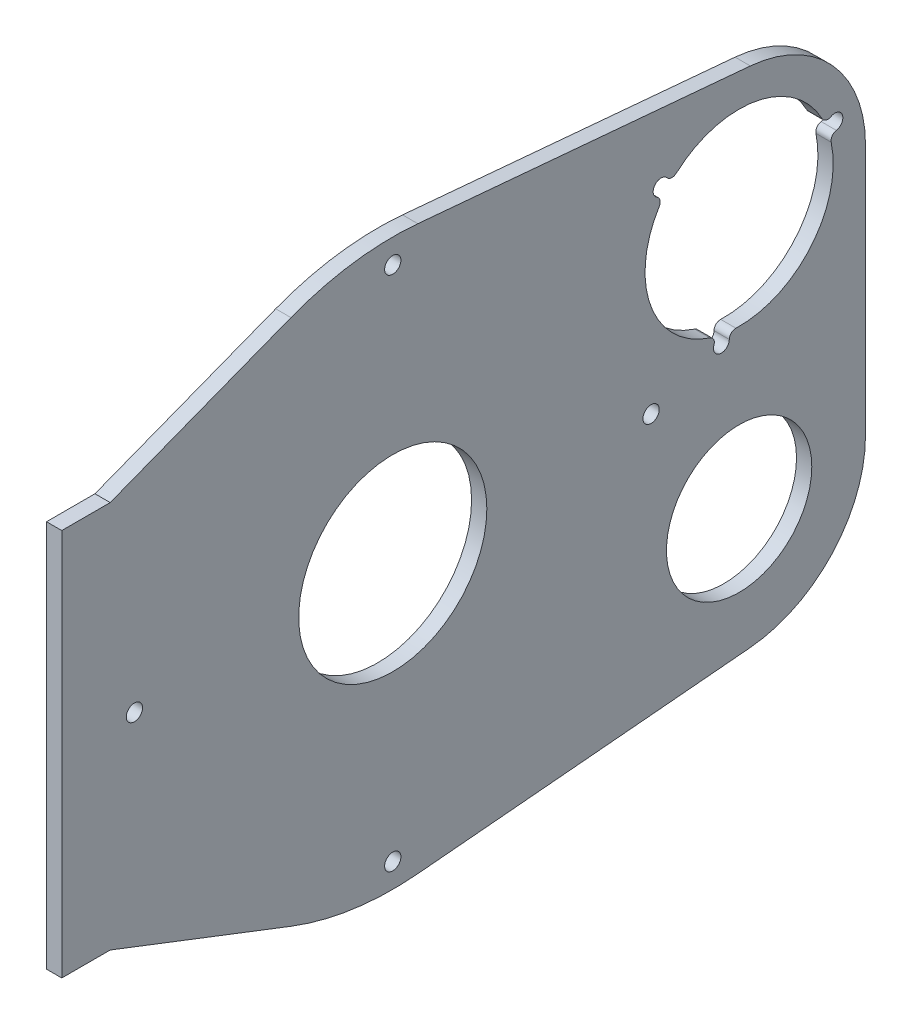
ISO-10303-21;
HEADER;
FILE_DESCRIPTION(('STEP AP214'),'2;1');
FILE_NAME('part.step','',(''),(''),'','','');
FILE_SCHEMA(('AUTOMOTIVE_DESIGN { 1 0 10303 214 1 1 1 1 }'));
ENDSEC;
DATA;
#1=APPLICATION_CONTEXT('core data for automotive mechanical design processes');
#2=APPLICATION_PROTOCOL_DEFINITION('international standard','automotive_design',2000,#1);
#3=PRODUCT_CONTEXT('',#1,'mechanical');
#4=PRODUCT('Part','Part','',(#3));
#5=PRODUCT_RELATED_PRODUCT_CATEGORY('part','',(#4));
#6=PRODUCT_DEFINITION_FORMATION('','',#4);
#7=PRODUCT_DEFINITION_CONTEXT('part definition',#1,'design');
#8=PRODUCT_DEFINITION('design','',#6,#7);
#9=PRODUCT_DEFINITION_SHAPE('','',#8);
#10=(LENGTH_UNIT() NAMED_UNIT(*) SI_UNIT(.MILLI.,.METRE.));
#11=(NAMED_UNIT(*) PLANE_ANGLE_UNIT() SI_UNIT($,.RADIAN.));
#12=(NAMED_UNIT(*) SI_UNIT($,.STERADIAN.) SOLID_ANGLE_UNIT());
#13=UNCERTAINTY_MEASURE_WITH_UNIT(LENGTH_MEASURE(1.E-05),#10,'distance_accuracy_value','');
#14=(GEOMETRIC_REPRESENTATION_CONTEXT(3) GLOBAL_UNCERTAINTY_ASSIGNED_CONTEXT((#13)) GLOBAL_UNIT_ASSIGNED_CONTEXT((#10,
#11,#12)) REPRESENTATION_CONTEXT('',''));
#15=CARTESIAN_POINT('',(0.,0.,0.));
#16=DIRECTION('',(0.,0.,1.));
#17=DIRECTION('',(1.,0.,0.));
#18=AXIS2_PLACEMENT_3D('',#15,#16,#17);
#19=CARTESIAN_POINT('',(3.,24.765,-68.1072365832002));
#20=DIRECTION('',(-1.,0.,0.));
#21=DIRECTION('',(0.,0.,1.));
#22=AXIS2_PLACEMENT_3D('',#19,#20,#21);
#23=CYLINDRICAL_SURFACE('',#22,18.5);
#24=CARTESIAN_POINT('',(3.,24.765,-68.1072365832002));
#25=DIRECTION('',(1.,0.,0.));
#26=DIRECTION('',(0.,0.,-1.));
#27=AXIS2_PLACEMENT_3D('',#24,#25,#26);
#28=CIRCLE('',#27,18.5);
#29=CARTESIAN_POINT('',(3.,33.4685169404879,-84.4320273281574));
#30=VERTEX_POINT('',#29);
#31=CARTESIAN_POINT('',(3.,38.534732477363,-55.7522996144473));
#32=VERTEX_POINT('',#31);
#33=EDGE_CURVE('E213',#30,#32,#28,.T.);
#34=ORIENTED_EDGE('',*,*,#33,.T.);
#35=DIRECTION('',(-1.,0.,0.));
#36=VECTOR('',#35,1.);
#37=CARTESIAN_POINT('',(3.,38.534732477363,-55.7522996144473));
#38=LINE('',#37,#36);
#39=CARTESIAN_POINT('',(0.,38.534732477363,-55.7522996144473));
#40=VERTEX_POINT('',#39);
#41=EDGE_CURVE('E196',#32,#40,#38,.T.);
#42=ORIENTED_EDGE('',*,*,#41,.T.);
#43=CARTESIAN_POINT('',(0.,24.765,-68.1072365832002));
#44=DIRECTION('',(1.,0.,0.));
#45=DIRECTION('',(0.,0.,-1.));
#46=AXIS2_PLACEMENT_3D('',#43,#44,#45);
#47=CIRCLE('',#46,18.5);
#48=CARTESIAN_POINT('',(0.,33.4685169404879,-84.4320273281574));
#49=VERTEX_POINT('',#48);
#50=EDGE_CURVE('E289',#49,#40,#47,.T.);
#51=ORIENTED_EDGE('',*,*,#50,.F.);
#52=DIRECTION('',(-1.,0.,0.));
#53=VECTOR('',#52,1.);
#54=CARTESIAN_POINT('',(3.,33.4685169404879,-84.4320273281574));
#55=LINE('',#54,#53);
#56=EDGE_CURVE('E220',#30,#49,#55,.T.);
#57=ORIENTED_EDGE('',*,*,#56,.F.);
#58=EDGE_LOOP('',(#34,#42,#51,#57));
#59=FACE_BOUND('',#58,.T.);
#60=ADVANCED_FACE('F35',(#59),#23,.F.);
#61=DIRECTION('',(-1.,0.,0.));
#62=VECTOR('',#61,1.);
#63=CARTESIAN_POINT('',(3.,34.550925026354,-52.4073744379908));
#64=LINE('',#63,#62);
#65=CARTESIAN_POINT('',(3.,34.550925026354,-52.4073744379908));
#66=VERTEX_POINT('',#65);
#67=CARTESIAN_POINT('',(0.,34.550925026354,-52.4073744379908));
#68=VERTEX_POINT('',#67);
#69=EDGE_CURVE('E58',#66,#68,#64,.T.);
#70=ORIENTED_EDGE('',*,*,#69,.F.);
#71=CARTESIAN_POINT('',(3.,7.18044448422303,-62.3597669388647));
#72=VERTEX_POINT('',#71);
#73=EDGE_CURVE('E222',#66,#72,#28,.T.);
#74=ORIENTED_EDGE('',*,*,#73,.T.);
#75=DIRECTION('',(-1.,0.,0.));
#76=VECTOR('',#75,1.);
#77=CARTESIAN_POINT('',(3.,7.18044448422303,-62.3597669388647));
#78=LINE('',#77,#76);
#79=CARTESIAN_POINT('',(0.,7.18044448422303,-62.3597669388647));
#80=VERTEX_POINT('',#79);
#81=EDGE_CURVE('E309',#72,#80,#78,.T.);
#82=ORIENTED_EDGE('',*,*,#81,.T.);
#83=EDGE_CURVE('E339',#68,#80,#47,.T.);
#84=ORIENTED_EDGE('',*,*,#83,.F.);
#85=EDGE_LOOP('',(#70,#74,#82,#84));
#86=FACE_BOUND('',#85,.T.);
#87=ADVANCED_FACE('F337',(#86),#23,.F.);
#88=DIRECTION('',(-1.,0.,0.));
#89=VECTOR('',#88,1.);
#90=CARTESIAN_POINT('',(3.,6.27555803315802,-67.4823079834525));
#91=LINE('',#90,#89);
#92=CARTESIAN_POINT('',(3.,6.27555803315802,-67.4823079834525));
#93=VERTEX_POINT('',#92);
#94=CARTESIAN_POINT('',(0.,6.27555803315801,-67.4823079834525));
#95=VERTEX_POINT('',#94);
#96=EDGE_CURVE('E50',#93,#95,#91,.T.);
#97=ORIENTED_EDGE('',*,*,#96,.F.);
#98=CARTESIAN_POINT('',(3.,28.5798230384139,-86.2096431962886));
#99=VERTEX_POINT('',#98);
#100=EDGE_CURVE('E224',#93,#99,#28,.T.);
#101=ORIENTED_EDGE('',*,*,#100,.T.);
#102=DIRECTION('',(-1.,0.,0.));
#103=VECTOR('',#102,1.);
#104=CARTESIAN_POINT('',(3.,28.5798230384139,-86.2096431962886));
#105=LINE('',#104,#103);
#106=CARTESIAN_POINT('',(0.,28.5798230384139,-86.2096431962886));
#107=VERTEX_POINT('',#106);
#108=EDGE_CURVE('E290',#99,#107,#105,.T.);
#109=ORIENTED_EDGE('',*,*,#108,.T.);
#110=EDGE_CURVE('E342',#95,#107,#47,.T.);
#111=ORIENTED_EDGE('',*,*,#110,.F.);
#112=EDGE_LOOP('',(#97,#101,#109,#111));
#113=FACE_BOUND('',#112,.T.);
#114=ADVANCED_FACE('F402',(#113),#23,.F.);
#115=CARTESIAN_POINT('',(3.,0.,0.));
#116=DIRECTION('',(-1.,0.,0.));
#117=DIRECTION('',(0.,0.,1.));
#118=AXIS2_PLACEMENT_3D('',#115,#116,#117);
#119=CYLINDRICAL_SURFACE('',#118,55.5625);
#120=CARTESIAN_POINT('',(0.,0.,0.));
#121=DIRECTION('',(1.,0.,0.));
#122=DIRECTION('',(0.,0.,-1.));
#123=AXIS2_PLACEMENT_3D('',#120,#121,#122);
#124=CIRCLE('',#123,55.5625);
#125=CARTESIAN_POINT('',(0.,-55.3431935303165,-4.93176805171632));
#126=VERTEX_POINT('',#125);
#127=CARTESIAN_POINT('',(0.,-51.8295391449195,20.0222445863409));
#128=VERTEX_POINT('',#127);
#129=EDGE_CURVE('E471',#126,#128,#124,.F.);
#130=ORIENTED_EDGE('',*,*,#129,.F.);
#131=DIRECTION('',(-1.,0.,0.));
#132=VECTOR('',#131,1.);
#133=CARTESIAN_POINT('',(3.,-55.3431935303165,-4.93176805171632));
#134=LINE('',#133,#132);
#135=CARTESIAN_POINT('',(3.,-55.3431935303165,-4.93176805171632));
#136=VERTEX_POINT('',#135);
#137=EDGE_CURVE('E368',#136,#126,#134,.T.);
#138=ORIENTED_EDGE('',*,*,#137,.F.);
#139=CARTESIAN_POINT('',(3.,0.,0.));
#140=DIRECTION('',(1.,0.,0.));
#141=DIRECTION('',(0.,0.,-1.));
#142=AXIS2_PLACEMENT_3D('',#139,#140,#141);
#143=CIRCLE('',#142,55.5625);
#144=CARTESIAN_POINT('',(3.,-51.8295391449195,20.0222445863409));
#145=VERTEX_POINT('',#144);
#146=EDGE_CURVE('E274',#136,#145,#143,.F.);
#147=ORIENTED_EDGE('',*,*,#146,.T.);
#148=DIRECTION('',(-1.,0.,0.));
#149=VECTOR('',#148,1.);
#150=CARTESIAN_POINT('',(3.,-51.8295391449195,20.0222445863409));
#151=LINE('',#150,#149);
#152=EDGE_CURVE('E221',#145,#128,#151,.T.);
#153=ORIENTED_EDGE('',*,*,#152,.T.);
#154=EDGE_LOOP('',(#130,#138,#147,#153));
#155=FACE_BOUND('',#154,.T.);
#156=ADVANCED_FACE('F409',(#155),#119,.T.);
#157=CARTESIAN_POINT('',(3.,-55.3431935303165,-4.93176805171631));
#158=DIRECTION('',(0.,-0.996052976923582,-0.0887607298396637));
#159=DIRECTION('',(0.,0.0887607298396637,-0.996052976923582));
#160=AXIS2_PLACEMENT_3D('',#157,#158,#159);
#161=PLANE('',#160);
#162=DIRECTION('',(0.,-0.0887607298396637,0.996052976923582));
#163=VECTOR('',#162,1.);
#164=CARTESIAN_POINT('',(0.,-55.3431935303165,-4.93176805171631));
#165=LINE('',#164,#163);
#166=CARTESIAN_POINT('',(0.,-49.516916476551,-70.3129407197158));
#167=VERTEX_POINT('',#166);
#168=EDGE_CURVE('E510',#167,#126,#165,.T.);
#169=ORIENTED_EDGE('',*,*,#168,.F.);
#170=DIRECTION('',(-1.,0.,0.));
#171=VECTOR('',#170,1.);
#172=CARTESIAN_POINT('',(3.,-49.516916476551,-70.3129407197158));
#173=LINE('',#172,#171);
#174=CARTESIAN_POINT('',(3.,-49.516916476551,-70.3129407197158));
#175=VERTEX_POINT('',#174);
#176=EDGE_CURVE('E366',#175,#167,#173,.T.);
#177=ORIENTED_EDGE('',*,*,#176,.F.);
#178=DIRECTION('',(0.,-0.0887607298396637,0.996052976923582));
#179=VECTOR('',#178,1.);
#180=CARTESIAN_POINT('',(3.,-55.3431935303165,-4.93176805171631));
#181=LINE('',#180,#179);
#182=EDGE_CURVE('E271',#175,#136,#181,.T.);
#183=ORIENTED_EDGE('',*,*,#182,.T.);
#184=ORIENTED_EDGE('',*,*,#137,.T.);
#185=EDGE_LOOP('',(#169,#177,#183,#184));
#186=FACE_BOUND('',#185,.T.);
#187=ADVANCED_FACE('F413',(#186),#161,.T.);
#188=CARTESIAN_POINT('',(3.,-24.765,-68.1072365832002));
#189=DIRECTION('',(-1.,0.,0.));
#190=DIRECTION('',(0.,0.,1.));
#191=AXIS2_PLACEMENT_3D('',#188,#189,#190);
#192=CYLINDRICAL_SURFACE('',#191,24.85);
#193=CARTESIAN_POINT('',(0.,-24.765,-68.1072365832002));
#194=DIRECTION('',(1.,0.,0.));
#195=DIRECTION('',(0.,0.,-1.));
#196=AXIS2_PLACEMENT_3D('',#193,#194,#195);
#197=CIRCLE('',#196,24.85);
#198=CARTESIAN_POINT('',(0.,-24.765,-92.9572365832002));
#199=VERTEX_POINT('',#198);
#200=EDGE_CURVE('E507',#199,#167,#197,.F.);
#201=ORIENTED_EDGE('',*,*,#200,.F.);
#202=DIRECTION('',(-1.,0.,0.));
#203=VECTOR('',#202,1.);
#204=CARTESIAN_POINT('',(3.,-24.765,-92.9572365832002));
#205=LINE('',#204,#203);
#206=CARTESIAN_POINT('',(3.,-24.765,-92.9572365832002));
#207=VERTEX_POINT('',#206);
#208=EDGE_CURVE('E364',#207,#199,#205,.T.);
#209=ORIENTED_EDGE('',*,*,#208,.F.);
#210=CARTESIAN_POINT('',(3.,-24.765,-68.1072365832002));
#211=DIRECTION('',(1.,0.,0.));
#212=DIRECTION('',(0.,0.,-1.));
#213=AXIS2_PLACEMENT_3D('',#210,#211,#212);
#214=CIRCLE('',#213,24.85);
#215=EDGE_CURVE('E268',#207,#175,#214,.F.);
#216=ORIENTED_EDGE('',*,*,#215,.T.);
#217=ORIENTED_EDGE('',*,*,#176,.T.);
#218=EDGE_LOOP('',(#201,#209,#216,#217));
#219=FACE_BOUND('',#218,.T.);
#220=ADVANCED_FACE('F557',(#219),#192,.T.);
#221=CARTESIAN_POINT('',(3.,0.,-92.9572365832002));
#222=DIRECTION('',(0.,0.,-1.));
#223=DIRECTION('',(-1.,0.,0.));
#224=AXIS2_PLACEMENT_3D('',#221,#222,#223);
#225=PLANE('',#224);
#226=DIRECTION('',(0.,-1.,0.));
#227=VECTOR('',#226,1.);
#228=CARTESIAN_POINT('',(0.,0.,-92.9572365832002));
#229=LINE('',#228,#227);
#230=CARTESIAN_POINT('',(0.,24.765,-92.9572365832002));
#231=VERTEX_POINT('',#230);
#232=EDGE_CURVE('E504',#231,#199,#229,.T.);
#233=ORIENTED_EDGE('',*,*,#232,.F.);
#234=DIRECTION('',(-1.,0.,0.));
#235=VECTOR('',#234,1.);
#236=CARTESIAN_POINT('',(3.,24.765,-92.9572365832002));
#237=LINE('',#236,#235);
#238=CARTESIAN_POINT('',(3.,24.765,-92.9572365832002));
#239=VERTEX_POINT('',#238);
#240=EDGE_CURVE('E362',#239,#231,#237,.T.);
#241=ORIENTED_EDGE('',*,*,#240,.F.);
#242=DIRECTION('',(0.,-1.,0.));
#243=VECTOR('',#242,1.);
#244=CARTESIAN_POINT('',(3.,0.,-92.9572365832002));
#245=LINE('',#244,#243);
#246=EDGE_CURVE('E265',#239,#207,#245,.T.);
#247=ORIENTED_EDGE('',*,*,#246,.T.);
#248=ORIENTED_EDGE('',*,*,#208,.T.);
#249=EDGE_LOOP('',(#233,#241,#247,#248));
#250=FACE_BOUND('',#249,.T.);
#251=ADVANCED_FACE('F554',(#250),#225,.T.);
#252=CARTESIAN_POINT('',(3.,24.765,-68.1072365832002));
#253=DIRECTION('',(-1.,0.,0.));
#254=DIRECTION('',(0.,0.,1.));
#255=AXIS2_PLACEMENT_3D('',#252,#253,#254);
#256=CYLINDRICAL_SURFACE('',#255,24.85);
#257=CARTESIAN_POINT('',(0.,24.765,-68.1072365832002));
#258=DIRECTION('',(1.,0.,0.));
#259=DIRECTION('',(0.,0.,-1.));
#260=AXIS2_PLACEMENT_3D('',#257,#258,#259);
#261=CIRCLE('',#260,24.85);
#262=CARTESIAN_POINT('',(0.,49.516916476551,-70.3129407197158));
#263=VERTEX_POINT('',#262);
#264=EDGE_CURVE('E501',#263,#231,#261,.F.);
#265=ORIENTED_EDGE('',*,*,#264,.F.);
#266=DIRECTION('',(-1.,0.,0.));
#267=VECTOR('',#266,1.);
#268=CARTESIAN_POINT('',(3.,49.516916476551,-70.3129407197158));
#269=LINE('',#268,#267);
#270=CARTESIAN_POINT('',(3.,49.516916476551,-70.3129407197158));
#271=VERTEX_POINT('',#270);
#272=EDGE_CURVE('E360',#271,#263,#269,.T.);
#273=ORIENTED_EDGE('',*,*,#272,.F.);
#274=CARTESIAN_POINT('',(3.,24.765,-68.1072365832002));
#275=DIRECTION('',(1.,0.,0.));
#276=DIRECTION('',(0.,0.,-1.));
#277=AXIS2_PLACEMENT_3D('',#274,#275,#276);
#278=CIRCLE('',#277,24.85);
#279=EDGE_CURVE('E262',#271,#239,#278,.F.);
#280=ORIENTED_EDGE('',*,*,#279,.T.);
#281=ORIENTED_EDGE('',*,*,#240,.T.);
#282=EDGE_LOOP('',(#265,#273,#280,#281));
#283=FACE_BOUND('',#282,.T.);
#284=ADVANCED_FACE('F550',(#283),#256,.T.);
#285=CARTESIAN_POINT('',(3.,55.3431935303165,-4.9317680517163));
#286=DIRECTION('',(0.,0.996052976923582,-0.0887607298396635));
#287=DIRECTION('',(0.,0.0887607298396635,0.996052976923582));
#288=AXIS2_PLACEMENT_3D('',#285,#286,#287);
#289=PLANE('',#288);
#290=DIRECTION('',(0.,-0.0887607298396635,-0.996052976923582));
#291=VECTOR('',#290,1.);
#292=CARTESIAN_POINT('',(0.,55.3431935303165,-4.9317680517163));
#293=LINE('',#292,#291);
#294=CARTESIAN_POINT('',(0.,55.3431935303165,-4.93176805171631));
#295=VERTEX_POINT('',#294);
#296=EDGE_CURVE('E498',#295,#263,#293,.T.);
#297=ORIENTED_EDGE('',*,*,#296,.F.);
#298=DIRECTION('',(-1.,0.,0.));
#299=VECTOR('',#298,1.);
#300=CARTESIAN_POINT('',(3.,55.3431935303165,-4.93176805171631));
#301=LINE('',#300,#299);
#302=CARTESIAN_POINT('',(3.,55.3431935303165,-4.93176805171631));
#303=VERTEX_POINT('',#302);
#304=EDGE_CURVE('E358',#303,#295,#301,.T.);
#305=ORIENTED_EDGE('',*,*,#304,.F.);
#306=DIRECTION('',(0.,-0.0887607298396635,-0.996052976923582));
#307=VECTOR('',#306,1.);
#308=CARTESIAN_POINT('',(3.,55.3431935303165,-4.9317680517163));
#309=LINE('',#308,#307);
#310=EDGE_CURVE('E259',#303,#271,#309,.T.);
#311=ORIENTED_EDGE('',*,*,#310,.T.);
#312=ORIENTED_EDGE('',*,*,#272,.T.);
#313=EDGE_LOOP('',(#297,#305,#311,#312));
#314=FACE_BOUND('',#313,.T.);
#315=ADVANCED_FACE('F546',(#314),#289,.T.);
#316=CARTESIAN_POINT('',(3.,0.,0.));
#317=DIRECTION('',(-1.,0.,0.));
#318=DIRECTION('',(0.,0.,1.));
#319=AXIS2_PLACEMENT_3D('',#316,#317,#318);
#320=CYLINDRICAL_SURFACE('',#319,55.5625);
#321=CARTESIAN_POINT('',(0.,0.,0.));
#322=DIRECTION('',(1.,0.,0.));
#323=DIRECTION('',(0.,0.,-1.));
#324=AXIS2_PLACEMENT_3D('',#321,#322,#323);
#325=CIRCLE('',#324,55.5625);
#326=CARTESIAN_POINT('',(0.,51.8295391449195,20.0222445863409));
#327=VERTEX_POINT('',#326);
#328=EDGE_CURVE('E495',#327,#295,#325,.F.);
#329=ORIENTED_EDGE('',*,*,#328,.F.);
#330=DIRECTION('',(-1.,0.,0.));
#331=VECTOR('',#330,1.);
#332=CARTESIAN_POINT('',(3.,51.8295391449195,20.0222445863409));
#333=LINE('',#332,#331);
#334=CARTESIAN_POINT('',(3.,51.8295391449195,20.0222445863409));
#335=VERTEX_POINT('',#334);
#336=EDGE_CURVE('E356',#335,#327,#333,.T.);
#337=ORIENTED_EDGE('',*,*,#336,.F.);
#338=CARTESIAN_POINT('',(3.,0.,0.));
#339=DIRECTION('',(1.,0.,0.));
#340=DIRECTION('',(0.,0.,-1.));
#341=AXIS2_PLACEMENT_3D('',#338,#339,#340);
#342=CIRCLE('',#341,55.5625);
#343=EDGE_CURVE('E256',#335,#303,#342,.F.);
#344=ORIENTED_EDGE('',*,*,#343,.T.);
#345=ORIENTED_EDGE('',*,*,#304,.T.);
#346=EDGE_LOOP('',(#329,#337,#344,#345));
#347=FACE_BOUND('',#346,.T.);
#348=ADVANCED_FACE('F542',(#347),#320,.T.);
#349=CARTESIAN_POINT('',(3.,51.8295391449195,20.0222445863409));
#350=DIRECTION('',(0.,0.932815102720711,0.36035535813437));
#351=DIRECTION('',(0.,-0.36035535813437,0.932815102720711));
#352=AXIS2_PLACEMENT_3D('',#349,#350,#351);
#353=PLANE('',#352);
#354=DIRECTION('',(0.,0.36035535813437,-0.932815102720711));
#355=VECTOR('',#354,1.);
#356=CARTESIAN_POINT('',(0.,51.8295391449195,20.0222445863409));
#357=LINE('',#356,#355);
#358=CARTESIAN_POINT('',(0.,38.1,55.5625));
#359=VERTEX_POINT('',#358);
#360=EDGE_CURVE('E492',#359,#327,#357,.T.);
#361=ORIENTED_EDGE('',*,*,#360,.F.);
#362=DIRECTION('',(-1.,0.,0.));
#363=VECTOR('',#362,1.);
#364=CARTESIAN_POINT('',(3.,38.1,55.5625));
#365=LINE('',#364,#363);
#366=CARTESIAN_POINT('',(3.,38.1,55.5625));
#367=VERTEX_POINT('',#366);
#368=EDGE_CURVE('E354',#367,#359,#365,.T.);
#369=ORIENTED_EDGE('',*,*,#368,.F.);
#370=DIRECTION('',(0.,0.36035535813437,-0.932815102720711));
#371=VECTOR('',#370,1.);
#372=CARTESIAN_POINT('',(3.,51.8295391449195,20.0222445863409));
#373=LINE('',#372,#371);
#374=EDGE_CURVE('E253',#367,#335,#373,.T.);
#375=ORIENTED_EDGE('',*,*,#374,.T.);
#376=ORIENTED_EDGE('',*,*,#336,.T.);
#377=EDGE_LOOP('',(#361,#369,#375,#376));
#378=FACE_BOUND('',#377,.T.);
#379=ADVANCED_FACE('F538',(#378),#353,.T.);
#380=CARTESIAN_POINT('',(3.,38.1,0.));
#381=DIRECTION('',(0.,1.,0.));
#382=DIRECTION('',(0.,0.,1.));
#383=AXIS2_PLACEMENT_3D('',#380,#381,#382);
#384=PLANE('',#383);
#385=DIRECTION('',(0.,0.,-1.));
#386=VECTOR('',#385,1.);
#387=CARTESIAN_POINT('',(0.,38.1,0.));
#388=LINE('',#387,#386);
#389=CARTESIAN_POINT('',(0.,38.1,65.0875));
#390=VERTEX_POINT('',#389);
#391=EDGE_CURVE('E489',#390,#359,#388,.T.);
#392=ORIENTED_EDGE('',*,*,#391,.F.);
#393=DIRECTION('',(-1.,0.,0.));
#394=VECTOR('',#393,1.);
#395=CARTESIAN_POINT('',(3.,38.1,65.0875));
#396=LINE('',#395,#394);
#397=CARTESIAN_POINT('',(3.,38.1,65.0875));
#398=VERTEX_POINT('',#397);
#399=EDGE_CURVE('E352',#398,#390,#396,.T.);
#400=ORIENTED_EDGE('',*,*,#399,.F.);
#401=DIRECTION('',(0.,0.,-1.));
#402=VECTOR('',#401,1.);
#403=CARTESIAN_POINT('',(3.,38.1,0.));
#404=LINE('',#403,#402);
#405=EDGE_CURVE('E250',#398,#367,#404,.T.);
#406=ORIENTED_EDGE('',*,*,#405,.T.);
#407=ORIENTED_EDGE('',*,*,#368,.T.);
#408=EDGE_LOOP('',(#392,#400,#406,#407));
#409=FACE_BOUND('',#408,.T.);
#410=ADVANCED_FACE('F534',(#409),#384,.T.);
#411=CARTESIAN_POINT('',(3.,0.,65.0875));
#412=DIRECTION('',(0.,0.,-1.));
#413=DIRECTION('',(-1.,0.,0.));
#414=AXIS2_PLACEMENT_3D('',#411,#412,#413);
#415=PLANE('',#414);
#416=DIRECTION('',(0.,-1.,0.));
#417=VECTOR('',#416,1.);
#418=CARTESIAN_POINT('',(0.,0.,65.0875));
#419=LINE('',#418,#417);
#420=CARTESIAN_POINT('',(0.,-38.1,65.0875));
#421=VERTEX_POINT('',#420);
#422=EDGE_CURVE('E486',#390,#421,#419,.T.);
#423=ORIENTED_EDGE('',*,*,#422,.T.);
#424=DIRECTION('',(-1.,0.,0.));
#425=VECTOR('',#424,1.);
#426=CARTESIAN_POINT('',(3.,-38.1,65.0875));
#427=LINE('',#426,#425);
#428=CARTESIAN_POINT('',(3.,-38.1,65.0875));
#429=VERTEX_POINT('',#428);
#430=EDGE_CURVE('E349',#429,#421,#427,.T.);
#431=ORIENTED_EDGE('',*,*,#430,.F.);
#432=DIRECTION('',(0.,-1.,0.));
#433=VECTOR('',#432,1.);
#434=CARTESIAN_POINT('',(3.,0.,65.0875));
#435=LINE('',#434,#433);
#436=EDGE_CURVE('E247',#398,#429,#435,.T.);
#437=ORIENTED_EDGE('',*,*,#436,.F.);
#438=ORIENTED_EDGE('',*,*,#399,.T.);
#439=EDGE_LOOP('',(#423,#431,#437,#438));
#440=FACE_BOUND('',#439,.T.);
#441=ADVANCED_FACE('F531',(#440),#415,.F.);
#442=CARTESIAN_POINT('',(3.,-38.1,0.));
#443=DIRECTION('',(0.,1.,0.));
#444=DIRECTION('',(0.,0.,1.));
#445=AXIS2_PLACEMENT_3D('',#442,#443,#444);
#446=PLANE('',#445);
#447=DIRECTION('',(0.,0.,-1.));
#448=VECTOR('',#447,1.);
#449=CARTESIAN_POINT('',(0.,-38.1,0.));
#450=LINE('',#449,#448);
#451=CARTESIAN_POINT('',(0.,-38.1,55.5625));
#452=VERTEX_POINT('',#451);
#453=EDGE_CURVE('E481',#421,#452,#450,.T.);
#454=ORIENTED_EDGE('',*,*,#453,.T.);
#455=DIRECTION('',(-1.,0.,0.));
#456=VECTOR('',#455,1.);
#457=CARTESIAN_POINT('',(3.,-38.1,55.5625));
#458=LINE('',#457,#456);
#459=CARTESIAN_POINT('',(3.,-38.1,55.5625));
#460=VERTEX_POINT('',#459);
#461=EDGE_CURVE('E225',#460,#452,#458,.T.);
#462=ORIENTED_EDGE('',*,*,#461,.F.);
#463=DIRECTION('',(0.,0.,-1.));
#464=VECTOR('',#463,1.);
#465=CARTESIAN_POINT('',(3.,-38.1,0.));
#466=LINE('',#465,#464);
#467=EDGE_CURVE('E245',#429,#460,#466,.T.);
#468=ORIENTED_EDGE('',*,*,#467,.F.);
#469=ORIENTED_EDGE('',*,*,#430,.T.);
#470=EDGE_LOOP('',(#454,#462,#468,#469));
#471=FACE_BOUND('',#470,.T.);
#472=ADVANCED_FACE('F528',(#471),#446,.F.);
#473=CARTESIAN_POINT('',(3.,-24.765,-68.1072365832002));
#474=DIRECTION('',(-1.,0.,0.));
#475=DIRECTION('',(0.,0.,1.));
#476=AXIS2_PLACEMENT_3D('',#473,#474,#475);
#477=CYLINDRICAL_SURFACE('',#476,14.2875);
#478=CARTESIAN_POINT('',(3.,-24.765,-68.1072365832002));
#479=DIRECTION('',(1.,0.,0.));
#480=DIRECTION('',(0.,0.,-1.));
#481=AXIS2_PLACEMENT_3D('',#478,#479,#480);
#482=CIRCLE('',#481,14.2875);
#483=CARTESIAN_POINT('',(3.,-24.765,-82.3947365832002));
#484=VERTEX_POINT('',#483);
#485=EDGE_CURVE('E230',#484,#484,#482,.T.);
#486=ORIENTED_EDGE('',*,*,#485,.T.);
#487=EDGE_LOOP('',(#486));
#488=FACE_BOUND('',#487,.T.);
#489=CARTESIAN_POINT('',(0.,-24.765,-68.1072365832002));
#490=DIRECTION('',(1.,0.,0.));
#491=DIRECTION('',(0.,0.,-1.));
#492=AXIS2_PLACEMENT_3D('',#489,#490,#491);
#493=CIRCLE('',#492,14.2875);
#494=CARTESIAN_POINT('',(0.,-24.765,-82.3947365832002));
#495=VERTEX_POINT('',#494);
#496=EDGE_CURVE('E344',#495,#495,#493,.T.);
#497=ORIENTED_EDGE('',*,*,#496,.F.);
#498=EDGE_LOOP('',(#497));
#499=FACE_BOUND('',#498,.T.);
#500=ADVANCED_FACE('F566',(#488,#499),#477,.F.);
#501=CARTESIAN_POINT('',(3.,0.,0.));
#502=DIRECTION('',(-1.,0.,0.));
#503=DIRECTION('',(0.,0.,1.));
#504=AXIS2_PLACEMENT_3D('',#501,#502,#503);
#505=CYLINDRICAL_SURFACE('',#504,18.5);
#506=CARTESIAN_POINT('',(3.,0.,0.));
#507=DIRECTION('',(1.,0.,0.));
#508=DIRECTION('',(0.,0.,-1.));
#509=AXIS2_PLACEMENT_3D('',#506,#507,#508);
#510=CIRCLE('',#509,18.5);
#511=CARTESIAN_POINT('',(3.,0.,-18.5));
#512=VERTEX_POINT('',#511);
#513=EDGE_CURVE('E236',#512,#512,#510,.T.);
#514=ORIENTED_EDGE('',*,*,#513,.T.);
#515=EDGE_LOOP('',(#514));
#516=FACE_BOUND('',#515,.T.);
#517=CARTESIAN_POINT('',(0.,0.,0.));
#518=DIRECTION('',(1.,0.,0.));
#519=DIRECTION('',(0.,0.,-1.));
#520=AXIS2_PLACEMENT_3D('',#517,#518,#519);
#521=CIRCLE('',#520,18.5);
#522=CARTESIAN_POINT('',(0.,0.,-18.5));
#523=VERTEX_POINT('',#522);
#524=EDGE_CURVE('E476',#523,#523,#521,.T.);
#525=ORIENTED_EDGE('',*,*,#524,.F.);
#526=EDGE_LOOP('',(#525));
#527=FACE_BOUND('',#526,.T.);
#528=ADVANCED_FACE('F563',(#516,#527),#505,.F.);
#529=CARTESIAN_POINT('',(3.,-51.8295391449195,20.0222445863409));
#530=DIRECTION('',(0.,-0.932815102720711,0.36035535813437));
#531=DIRECTION('',(0.,-0.36035535813437,-0.932815102720711));
#532=AXIS2_PLACEMENT_3D('',#529,#530,#531);
#533=PLANE('',#532);
#534=DIRECTION('',(0.,0.36035535813437,0.932815102720711));
#535=VECTOR('',#534,1.);
#536=CARTESIAN_POINT('',(0.,-51.8295391449195,20.0222445863409));
#537=LINE('',#536,#535);
#538=EDGE_CURVE('E480',#128,#452,#537,.T.);
#539=ORIENTED_EDGE('',*,*,#538,.F.);
#540=ORIENTED_EDGE('',*,*,#152,.F.);
#541=DIRECTION('',(0.,0.36035535813437,0.932815102720711));
#542=VECTOR('',#541,1.);
#543=CARTESIAN_POINT('',(3.,-51.8295391449195,20.0222445863409));
#544=LINE('',#543,#542);
#545=EDGE_CURVE('E240',#145,#460,#544,.T.);
#546=ORIENTED_EDGE('',*,*,#545,.T.);
#547=ORIENTED_EDGE('',*,*,#461,.T.);
#548=EDGE_LOOP('',(#539,#540,#546,#547));
#549=FACE_BOUND('',#548,.T.);
#550=ADVANCED_FACE('F522',(#549),#533,.T.);
#551=CARTESIAN_POINT('',(3.,50.8,0.));
#552=DIRECTION('',(-1.,0.,0.));
#553=DIRECTION('',(0.,0.,1.));
#554=AXIS2_PLACEMENT_3D('',#551,#552,#553);
#555=CYLINDRICAL_SURFACE('',#554,1.6);
#556=CARTESIAN_POINT('',(3.,50.8,0.));
#557=DIRECTION('',(1.,0.,0.));
#558=DIRECTION('',(0.,0.,-1.));
#559=AXIS2_PLACEMENT_3D('',#556,#557,#558);
#560=CIRCLE('',#559,1.6);
#561=CARTESIAN_POINT('',(3.,50.8,-1.6));
#562=VERTEX_POINT('',#561);
#563=EDGE_CURVE('E277',#562,#562,#560,.T.);
#564=ORIENTED_EDGE('',*,*,#563,.T.);
#565=EDGE_LOOP('',(#564));
#566=FACE_BOUND('',#565,.T.);
#567=CARTESIAN_POINT('',(0.,50.8,0.));
#568=DIRECTION('',(1.,0.,0.));
#569=DIRECTION('',(0.,0.,-1.));
#570=AXIS2_PLACEMENT_3D('',#567,#568,#569);
#571=CIRCLE('',#570,1.6);
#572=CARTESIAN_POINT('',(0.,50.8,-1.6));
#573=VERTEX_POINT('',#572);
#574=EDGE_CURVE('E465',#573,#573,#571,.T.);
#575=ORIENTED_EDGE('',*,*,#574,.F.);
#576=EDGE_LOOP('',(#575));
#577=FACE_BOUND('',#576,.T.);
#578=ADVANCED_FACE('F572',(#566,#577),#555,.F.);
#579=CARTESIAN_POINT('',(3.,0.,-50.8));
#580=DIRECTION('',(-1.,0.,0.));
#581=DIRECTION('',(0.,0.,1.));
#582=AXIS2_PLACEMENT_3D('',#579,#580,#581);
#583=CYLINDRICAL_SURFACE('',#582,1.6);
#584=CARTESIAN_POINT('',(3.,0.,-50.8));
#585=DIRECTION('',(1.,0.,0.));
#586=DIRECTION('',(0.,0.,-1.));
#587=AXIS2_PLACEMENT_3D('',#584,#585,#586);
#588=CIRCLE('',#587,1.6);
#589=CARTESIAN_POINT('',(3.,0.,-52.4));
#590=VERTEX_POINT('',#589);
#591=EDGE_CURVE('E280',#590,#590,#588,.T.);
#592=ORIENTED_EDGE('',*,*,#591,.T.);
#593=EDGE_LOOP('',(#592));
#594=FACE_BOUND('',#593,.T.);
#595=CARTESIAN_POINT('',(0.,0.,-50.8));
#596=DIRECTION('',(1.,0.,0.));
#597=DIRECTION('',(0.,0.,-1.));
#598=AXIS2_PLACEMENT_3D('',#595,#596,#597);
#599=CIRCLE('',#598,1.6);
#600=CARTESIAN_POINT('',(0.,0.,-52.4));
#601=VERTEX_POINT('',#600);
#602=EDGE_CURVE('E461',#601,#601,#599,.T.);
#603=ORIENTED_EDGE('',*,*,#602,.F.);
#604=EDGE_LOOP('',(#603));
#605=FACE_BOUND('',#604,.T.);
#606=ADVANCED_FACE('F597',(#594,#605),#583,.F.);
#607=CARTESIAN_POINT('',(3.,-50.8,0.));
#608=DIRECTION('',(-1.,0.,0.));
#609=DIRECTION('',(0.,0.,1.));
#610=AXIS2_PLACEMENT_3D('',#607,#608,#609);
#611=CYLINDRICAL_SURFACE('',#610,1.59999999999999);
#612=CARTESIAN_POINT('',(3.,-50.8,0.));
#613=DIRECTION('',(1.,0.,0.));
#614=DIRECTION('',(0.,0.,-1.));
#615=AXIS2_PLACEMENT_3D('',#612,#613,#614);
#616=CIRCLE('',#615,1.59999999999999);
#617=CARTESIAN_POINT('',(3.,-50.8,-1.6));
#618=VERTEX_POINT('',#617);
#619=EDGE_CURVE('E283',#618,#618,#616,.T.);
#620=ORIENTED_EDGE('',*,*,#619,.T.);
#621=EDGE_LOOP('',(#620));
#622=FACE_BOUND('',#621,.T.);
#623=CARTESIAN_POINT('',(0.,-50.8,0.));
#624=DIRECTION('',(1.,0.,0.));
#625=DIRECTION('',(0.,0.,-1.));
#626=AXIS2_PLACEMENT_3D('',#623,#624,#625);
#627=CIRCLE('',#626,1.59999999999999);
#628=CARTESIAN_POINT('',(0.,-50.8,-1.6));
#629=VERTEX_POINT('',#628);
#630=EDGE_CURVE('E457',#629,#629,#627,.T.);
#631=ORIENTED_EDGE('',*,*,#630,.F.);
#632=EDGE_LOOP('',(#631));
#633=FACE_BOUND('',#632,.T.);
#634=ADVANCED_FACE('F600',(#622,#633),#611,.F.);
#635=CARTESIAN_POINT('',(3.,0.,50.8));
#636=DIRECTION('',(-1.,0.,0.));
#637=DIRECTION('',(0.,0.,1.));
#638=AXIS2_PLACEMENT_3D('',#635,#636,#637);
#639=CYLINDRICAL_SURFACE('',#638,1.6);
#640=CARTESIAN_POINT('',(3.,0.,50.8));
#641=DIRECTION('',(1.,0.,0.));
#642=DIRECTION('',(0.,0.,-1.));
#643=AXIS2_PLACEMENT_3D('',#640,#641,#642);
#644=CIRCLE('',#643,1.6);
#645=CARTESIAN_POINT('',(3.,0.,49.2));
#646=VERTEX_POINT('',#645);
#647=EDGE_CURVE('E286',#646,#646,#644,.T.);
#648=ORIENTED_EDGE('',*,*,#647,.T.);
#649=EDGE_LOOP('',(#648));
#650=FACE_BOUND('',#649,.T.);
#651=CARTESIAN_POINT('',(0.,0.,50.8));
#652=DIRECTION('',(1.,0.,0.));
#653=DIRECTION('',(0.,0.,-1.));
#654=AXIS2_PLACEMENT_3D('',#651,#652,#653);
#655=CIRCLE('',#654,1.6);
#656=CARTESIAN_POINT('',(0.,0.,49.2));
#657=VERTEX_POINT('',#656);
#658=EDGE_CURVE('E300',#657,#657,#655,.T.);
#659=ORIENTED_EDGE('',*,*,#658,.F.);
#660=EDGE_LOOP('',(#659));
#661=FACE_BOUND('',#660,.T.);
#662=ADVANCED_FACE('F37',(#650,#661),#639,.F.);
#663=CARTESIAN_POINT('',(3.,0.,0.));
#664=DIRECTION('',(1.,0.,0.));
#665=DIRECTION('',(0.,0.,-1.));
#666=AXIS2_PLACEMENT_3D('',#663,#664,#665);
#667=PLANE('',#666);
#668=CARTESIAN_POINT('',(3.,39.4800060041873,-54.9041498874032));
#669=DIRECTION('',(1.,0.,0.));
#670=DIRECTION('',(0.,0.866025403784436,0.500000000000004));
#671=AXIS2_PLACEMENT_3D('',#668,#669,#670);
#672=CIRCLE('',#671,1.26999999999999);
#673=CARTESIAN_POINT('',(3.,38.6593095235058,-53.9349454267258));
#674=VERTEX_POINT('',#673);
#675=EDGE_CURVE('E200',#674,#32,#672,.T.);
#676=ORIENTED_EDGE('',*,*,#675,.T.);
#677=ORIENTED_EDGE('',*,*,#33,.F.);
#678=CARTESIAN_POINT('',(3.,34.066001616943,-85.5527021522706));
#679=DIRECTION('',(1.,0.,0.));
#680=DIRECTION('',(0.,0.,1.));
#681=AXIS2_PLACEMENT_3D('',#678,#679,#680);
#682=CIRCLE('',#681,1.27);
#683=CARTESIAN_POINT('',(3.,32.962919694962,-86.1820750730407));
#684=VERTEX_POINT('',#683);
#685=EDGE_CURVE('E303',#30,#684,#682,.T.);
#686=ORIENTED_EDGE('',*,*,#685,.T.);
#687=CARTESIAN_POINT('',(3.,31.6166386090796,-86.9502073779175));
#688=DIRECTION('',(-1.,0.,0.));
#689=DIRECTION('',(0.,0.,1.));
#690=AXIS2_PLACEMENT_3D('',#687,#688,#689);
#691=CIRCLE('',#690,1.55);
#692=CARTESIAN_POINT('',(3.,30.0914094095833,-87.2262071768375));
#693=VERTEX_POINT('',#692);
#694=EDGE_CURVE('E292',#684,#693,#691,.T.);
#695=ORIENTED_EDGE('',*,*,#694,.T.);
#696=CARTESIAN_POINT('',(3.,28.8417054848347,-87.4523489475654));
#697=DIRECTION('',(1.,0.,0.));
#698=DIRECTION('',(0.,0.,-1.));
#699=AXIS2_PLACEMENT_3D('',#696,#697,#698);
#700=CIRCLE('',#699,1.26999999999999);
#701=EDGE_CURVE('E305',#693,#99,#700,.T.);
#702=ORIENTED_EDGE('',*,*,#701,.T.);
#703=ORIENTED_EDGE('',*,*,#100,.F.);
#704=CARTESIAN_POINT('',(3.,5.00628282786671,-67.4394074795779));
#705=DIRECTION('',(1.,0.,0.));
#706=DIRECTION('',(0.,0.866025403784443,-0.499999999999992));
#707=AXIS2_PLACEMENT_3D('',#704,#705,#706);
#708=CIRCLE('',#707,1.27);
#709=CARTESIAN_POINT('',(3.,5.01277085101634,-66.169424052302));
#710=VERTEX_POINT('',#709);
#711=EDGE_CURVE('E321',#93,#710,#708,.T.);
#712=ORIENTED_EDGE('',*,*,#711,.T.);
#713=CARTESIAN_POINT('',(3.,5.02068930446671,-64.6194442788549));
#714=DIRECTION('',(-1.,0.,0.));
#715=DIRECTION('',(0.,0.866025403784443,-0.499999999999992));
#716=AXIS2_PLACEMENT_3D('',#713,#714,#715);
#717=CIRCLE('',#716,1.55);
#718=CARTESIAN_POINT('',(3.,5.54428106691075,-63.1605571460373));
#719=VERTEX_POINT('',#718);
#720=EDGE_CURVE('E312',#710,#719,#717,.T.);
#721=ORIENTED_EDGE('',*,*,#720,.T.);
#722=CARTESIAN_POINT('',(3.,5.9732885109778,-61.9652109146319));
#723=DIRECTION('',(1.,0.,0.));
#724=DIRECTION('',(0.,-0.866025403784443,0.499999999999992));
#725=AXIS2_PLACEMENT_3D('',#722,#723,#724);
#726=CIRCLE('',#725,1.26999999999999);
#727=EDGE_CURVE('E324',#719,#72,#726,.T.);
#728=ORIENTED_EDGE('',*,*,#727,.T.);
#729=ORIENTED_EDGE('',*,*,#73,.F.);
#730=CARTESIAN_POINT('',(3.,35.2227155551902,-51.3296001177521));
#731=DIRECTION('',(1.,0.,0.));
#732=DIRECTION('',(0.,-0.866025403784436,-0.500000000000004));
#733=AXIS2_PLACEMENT_3D('',#730,#731,#732);
#734=CIRCLE('',#733,1.27);
#735=CARTESIAN_POINT('',(3.,36.3193094540216,-51.970210624258));
#736=VERTEX_POINT('',#735);
#737=EDGE_CURVE('E216',#66,#736,#734,.T.);
#738=ORIENTED_EDGE('',*,*,#737,.T.);
#739=CARTESIAN_POINT('',(3.,37.6576720864536,-52.7520580928282));
#740=DIRECTION('',(-1.,0.,0.));
#741=DIRECTION('',(0.,-0.866025403784436,-0.500000000000004));
#742=AXIS2_PLACEMENT_3D('',#739,#740,#741);
#743=CIRCLE('',#742,1.55);
#744=EDGE_CURVE('E206',#736,#674,#743,.T.);
#745=ORIENTED_EDGE('',*,*,#744,.T.);
#746=EDGE_LOOP('',(#676,#677,#686,#695,#702,#703,#712,#721,#728,#729,#738,#745));
#747=FACE_BOUND('',#746,.T.);
#748=ORIENTED_EDGE('',*,*,#647,.F.);
#749=EDGE_LOOP('',(#748));
#750=FACE_BOUND('',#749,.T.);
#751=ORIENTED_EDGE('',*,*,#619,.F.);
#752=EDGE_LOOP('',(#751));
#753=FACE_BOUND('',#752,.T.);
#754=ORIENTED_EDGE('',*,*,#591,.F.);
#755=EDGE_LOOP('',(#754));
#756=FACE_BOUND('',#755,.T.);
#757=ORIENTED_EDGE('',*,*,#563,.F.);
#758=EDGE_LOOP('',(#757));
#759=FACE_BOUND('',#758,.T.);
#760=ORIENTED_EDGE('',*,*,#146,.F.);
#761=ORIENTED_EDGE('',*,*,#182,.F.);
#762=ORIENTED_EDGE('',*,*,#215,.F.);
#763=ORIENTED_EDGE('',*,*,#246,.F.);
#764=ORIENTED_EDGE('',*,*,#279,.F.);
#765=ORIENTED_EDGE('',*,*,#310,.F.);
#766=ORIENTED_EDGE('',*,*,#343,.F.);
#767=ORIENTED_EDGE('',*,*,#374,.F.);
#768=ORIENTED_EDGE('',*,*,#405,.F.);
#769=ORIENTED_EDGE('',*,*,#436,.T.);
#770=ORIENTED_EDGE('',*,*,#467,.T.);
#771=ORIENTED_EDGE('',*,*,#545,.F.);
#772=EDGE_LOOP('',(#760,#761,#762,#763,#764,#765,#766,#767,#768,#769,#770,#771));
#773=FACE_BOUND('',#772,.T.);
#774=ORIENTED_EDGE('',*,*,#513,.F.);
#775=EDGE_LOOP('',(#774));
#776=FACE_BOUND('',#775,.T.);
#777=ORIENTED_EDGE('',*,*,#485,.F.);
#778=EDGE_LOOP('',(#777));
#779=FACE_BOUND('',#778,.T.);
#780=ADVANCED_FACE('F210',(#747,#750,#753,#756,#759,#773,#776,#779),#667,.T.);
#781=CARTESIAN_POINT('',(0.,0.,0.));
#782=DIRECTION('',(1.,0.,0.));
#783=DIRECTION('',(0.,0.,-1.));
#784=AXIS2_PLACEMENT_3D('',#781,#782,#783);
#785=PLANE('',#784);
#786=ORIENTED_EDGE('',*,*,#658,.T.);
#787=EDGE_LOOP('',(#786));
#788=FACE_BOUND('',#787,.T.);
#789=ORIENTED_EDGE('',*,*,#630,.T.);
#790=EDGE_LOOP('',(#789));
#791=FACE_BOUND('',#790,.T.);
#792=ORIENTED_EDGE('',*,*,#602,.T.);
#793=EDGE_LOOP('',(#792));
#794=FACE_BOUND('',#793,.T.);
#795=ORIENTED_EDGE('',*,*,#574,.T.);
#796=EDGE_LOOP('',(#795));
#797=FACE_BOUND('',#796,.T.);
#798=ORIENTED_EDGE('',*,*,#129,.T.);
#799=ORIENTED_EDGE('',*,*,#538,.T.);
#800=ORIENTED_EDGE('',*,*,#453,.F.);
#801=ORIENTED_EDGE('',*,*,#422,.F.);
#802=ORIENTED_EDGE('',*,*,#391,.T.);
#803=ORIENTED_EDGE('',*,*,#360,.T.);
#804=ORIENTED_EDGE('',*,*,#328,.T.);
#805=ORIENTED_EDGE('',*,*,#296,.T.);
#806=ORIENTED_EDGE('',*,*,#264,.T.);
#807=ORIENTED_EDGE('',*,*,#232,.T.);
#808=ORIENTED_EDGE('',*,*,#200,.T.);
#809=ORIENTED_EDGE('',*,*,#168,.T.);
#810=EDGE_LOOP('',(#798,#799,#800,#801,#802,#803,#804,#805,#806,#807,#808,#809));
#811=FACE_BOUND('',#810,.T.);
#812=ORIENTED_EDGE('',*,*,#524,.T.);
#813=EDGE_LOOP('',(#812));
#814=FACE_BOUND('',#813,.T.);
#815=ORIENTED_EDGE('',*,*,#496,.T.);
#816=EDGE_LOOP('',(#815));
#817=FACE_BOUND('',#816,.T.);
#818=ORIENTED_EDGE('',*,*,#50,.T.);
#819=CARTESIAN_POINT('',(0.,39.4800060041873,-54.9041498874032));
#820=DIRECTION('',(1.,0.,0.));
#821=DIRECTION('',(0.,0.,-1.));
#822=AXIS2_PLACEMENT_3D('',#819,#820,#821);
#823=CIRCLE('',#822,1.26999999999999);
#824=CARTESIAN_POINT('',(0.,38.6593095235058,-53.9349454267258));
#825=VERTEX_POINT('',#824);
#826=EDGE_CURVE('E11',#40,#825,#823,.F.);
#827=ORIENTED_EDGE('',*,*,#826,.T.);
#828=CARTESIAN_POINT('',(0.,37.6576720864536,-52.7520580928282));
#829=DIRECTION('',(1.,0.,0.));
#830=DIRECTION('',(0.,0.,-1.));
#831=AXIS2_PLACEMENT_3D('',#828,#829,#830);
#832=CIRCLE('',#831,1.55);
#833=CARTESIAN_POINT('',(0.,36.3193094540216,-51.970210624258));
#834=VERTEX_POINT('',#833);
#835=EDGE_CURVE('E43',#825,#834,#832,.T.);
#836=ORIENTED_EDGE('',*,*,#835,.T.);
#837=CARTESIAN_POINT('',(0.,35.2227155551902,-51.3296001177521));
#838=DIRECTION('',(1.,0.,0.));
#839=DIRECTION('',(0.,0.,-1.));
#840=AXIS2_PLACEMENT_3D('',#837,#838,#839);
#841=CIRCLE('',#840,1.27);
#842=EDGE_CURVE('E386',#834,#68,#841,.F.);
#843=ORIENTED_EDGE('',*,*,#842,.T.);
#844=ORIENTED_EDGE('',*,*,#83,.T.);
#845=CARTESIAN_POINT('',(0.,5.9732885109778,-61.9652109146319));
#846=DIRECTION('',(1.,0.,0.));
#847=DIRECTION('',(0.,0.,-1.));
#848=AXIS2_PLACEMENT_3D('',#845,#846,#847);
#849=CIRCLE('',#848,1.26999999999999);
#850=CARTESIAN_POINT('',(0.,5.54428106691075,-63.1605571460373));
#851=VERTEX_POINT('',#850);
#852=EDGE_CURVE('E384',#80,#851,#849,.F.);
#853=ORIENTED_EDGE('',*,*,#852,.T.);
#854=CARTESIAN_POINT('',(0.,5.02068930446671,-64.6194442788549));
#855=DIRECTION('',(1.,0.,0.));
#856=DIRECTION('',(0.,0.,-1.));
#857=AXIS2_PLACEMENT_3D('',#854,#855,#856);
#858=CIRCLE('',#857,1.55);
#859=CARTESIAN_POINT('',(0.,5.01277085101634,-66.169424052302));
#860=VERTEX_POINT('',#859);
#861=EDGE_CURVE('E381',#851,#860,#858,.T.);
#862=ORIENTED_EDGE('',*,*,#861,.T.);
#863=CARTESIAN_POINT('',(0.,5.00628282786671,-67.4394074795779));
#864=DIRECTION('',(1.,0.,0.));
#865=DIRECTION('',(0.,0.,-1.));
#866=AXIS2_PLACEMENT_3D('',#863,#864,#865);
#867=CIRCLE('',#866,1.27);
#868=EDGE_CURVE('E379',#860,#95,#867,.F.);
#869=ORIENTED_EDGE('',*,*,#868,.T.);
#870=ORIENTED_EDGE('',*,*,#110,.T.);
#871=CARTESIAN_POINT('',(0.,28.8417054848347,-87.4523489475654));
#872=DIRECTION('',(1.,0.,0.));
#873=DIRECTION('',(0.,0.,-1.));
#874=AXIS2_PLACEMENT_3D('',#871,#872,#873);
#875=CIRCLE('',#874,1.26999999999999);
#876=CARTESIAN_POINT('',(0.,30.0914094095833,-87.2262071768375));
#877=VERTEX_POINT('',#876);
#878=EDGE_CURVE('E376',#107,#877,#875,.F.);
#879=ORIENTED_EDGE('',*,*,#878,.T.);
#880=CARTESIAN_POINT('',(0.,31.6166386090796,-86.9502073779175));
#881=DIRECTION('',(1.,0.,0.));
#882=DIRECTION('',(0.,0.,-1.));
#883=AXIS2_PLACEMENT_3D('',#880,#881,#882);
#884=CIRCLE('',#883,1.55);
#885=CARTESIAN_POINT('',(0.,32.962919694962,-86.1820750730407));
#886=VERTEX_POINT('',#885);
#887=EDGE_CURVE('E373',#877,#886,#884,.T.);
#888=ORIENTED_EDGE('',*,*,#887,.T.);
#889=CARTESIAN_POINT('',(0.,34.066001616943,-85.5527021522706));
#890=DIRECTION('',(1.,0.,0.));
#891=DIRECTION('',(0.,0.,-1.));
#892=AXIS2_PLACEMENT_3D('',#889,#890,#891);
#893=CIRCLE('',#892,1.27);
#894=EDGE_CURVE('E370',#886,#49,#893,.F.);
#895=ORIENTED_EDGE('',*,*,#894,.T.);
#896=EDGE_LOOP('',(#818,#827,#836,#843,#844,#853,#862,#869,#870,#879,#888,#895));
#897=FACE_BOUND('',#896,.T.);
#898=ADVANCED_FACE('F388',(#788,#791,#794,#797,#811,#814,#817,#897),#785,.F.);
#899=CARTESIAN_POINT('',(3.,28.8417054848347,-87.4523489475654));
#900=DIRECTION('',(-1.,0.,0.));
#901=DIRECTION('',(0.,0.,1.));
#902=AXIS2_PLACEMENT_3D('',#899,#900,#901);
#903=CYLINDRICAL_SURFACE('',#902,1.26999999999999);
#904=ORIENTED_EDGE('',*,*,#108,.F.);
#905=ORIENTED_EDGE('',*,*,#701,.F.);
#906=DIRECTION('',(-1.,0.,0.));
#907=VECTOR('',#906,1.);
#908=CARTESIAN_POINT('',(3.,30.0914094095833,-87.2262071768375));
#909=LINE('',#908,#907);
#910=EDGE_CURVE('E297',#693,#877,#909,.T.);
#911=ORIENTED_EDGE('',*,*,#910,.T.);
#912=ORIENTED_EDGE('',*,*,#878,.F.);
#913=EDGE_LOOP('',(#904,#905,#911,#912));
#914=FACE_BOUND('',#913,.T.);
#915=ADVANCED_FACE('F420',(#914),#903,.T.);
#916=CARTESIAN_POINT('',(3.,31.6166386090796,-86.9502073779175));
#917=DIRECTION('',(-1.,0.,0.));
#918=DIRECTION('',(0.,0.,1.));
#919=AXIS2_PLACEMENT_3D('',#916,#917,#918);
#920=CYLINDRICAL_SURFACE('',#919,1.55);
#921=ORIENTED_EDGE('',*,*,#910,.F.);
#922=ORIENTED_EDGE('',*,*,#694,.F.);
#923=DIRECTION('',(-1.,0.,0.));
#924=VECTOR('',#923,1.);
#925=CARTESIAN_POINT('',(3.,32.962919694962,-86.1820750730407));
#926=LINE('',#925,#924);
#927=EDGE_CURVE('E294',#684,#886,#926,.T.);
#928=ORIENTED_EDGE('',*,*,#927,.T.);
#929=ORIENTED_EDGE('',*,*,#887,.F.);
#930=EDGE_LOOP('',(#921,#922,#928,#929));
#931=FACE_BOUND('',#930,.T.);
#932=ADVANCED_FACE('F436',(#931),#920,.F.);
#933=CARTESIAN_POINT('',(3.,34.066001616943,-85.5527021522706));
#934=DIRECTION('',(-1.,0.,0.));
#935=DIRECTION('',(0.,0.,1.));
#936=AXIS2_PLACEMENT_3D('',#933,#934,#935);
#937=CYLINDRICAL_SURFACE('',#936,1.27);
#938=ORIENTED_EDGE('',*,*,#927,.F.);
#939=ORIENTED_EDGE('',*,*,#685,.F.);
#940=ORIENTED_EDGE('',*,*,#56,.T.);
#941=ORIENTED_EDGE('',*,*,#894,.F.);
#942=EDGE_LOOP('',(#938,#939,#940,#941));
#943=FACE_BOUND('',#942,.T.);
#944=ADVANCED_FACE('F429',(#943),#937,.T.);
#945=CARTESIAN_POINT('',(3.,5.9732885109778,-61.9652109146319));
#946=DIRECTION('',(-1.,0.,0.));
#947=DIRECTION('',(0.,0.,1.));
#948=AXIS2_PLACEMENT_3D('',#945,#946,#947);
#949=CYLINDRICAL_SURFACE('',#948,1.26999999999999);
#950=ORIENTED_EDGE('',*,*,#81,.F.);
#951=ORIENTED_EDGE('',*,*,#727,.F.);
#952=DIRECTION('',(-1.,0.,0.));
#953=VECTOR('',#952,1.);
#954=CARTESIAN_POINT('',(3.,5.54428106691075,-63.1605571460373));
#955=LINE('',#954,#953);
#956=EDGE_CURVE('E217',#719,#851,#955,.T.);
#957=ORIENTED_EDGE('',*,*,#956,.T.);
#958=ORIENTED_EDGE('',*,*,#852,.F.);
#959=EDGE_LOOP('',(#950,#951,#957,#958));
#960=FACE_BOUND('',#959,.T.);
#961=ADVANCED_FACE('F427',(#960),#949,.T.);
#962=CARTESIAN_POINT('',(3.,5.02068930446671,-64.6194442788549));
#963=DIRECTION('',(-1.,0.,0.));
#964=DIRECTION('',(0.,0.,1.));
#965=AXIS2_PLACEMENT_3D('',#962,#963,#964);
#966=CYLINDRICAL_SURFACE('',#965,1.55);
#967=ORIENTED_EDGE('',*,*,#956,.F.);
#968=ORIENTED_EDGE('',*,*,#720,.F.);
#969=DIRECTION('',(-1.,0.,0.));
#970=VECTOR('',#969,1.);
#971=CARTESIAN_POINT('',(3.,5.01277085101634,-66.169424052302));
#972=LINE('',#971,#970);
#973=EDGE_CURVE('E314',#710,#860,#972,.T.);
#974=ORIENTED_EDGE('',*,*,#973,.T.);
#975=ORIENTED_EDGE('',*,*,#861,.F.);
#976=EDGE_LOOP('',(#967,#968,#974,#975));
#977=FACE_BOUND('',#976,.T.);
#978=ADVANCED_FACE('F424',(#977),#966,.F.);
#979=CARTESIAN_POINT('',(3.,5.00628282786671,-67.4394074795779));
#980=DIRECTION('',(-1.,0.,0.));
#981=DIRECTION('',(0.,0.,1.));
#982=AXIS2_PLACEMENT_3D('',#979,#980,#981);
#983=CYLINDRICAL_SURFACE('',#982,1.27);
#984=ORIENTED_EDGE('',*,*,#973,.F.);
#985=ORIENTED_EDGE('',*,*,#711,.F.);
#986=ORIENTED_EDGE('',*,*,#96,.T.);
#987=ORIENTED_EDGE('',*,*,#868,.F.);
#988=EDGE_LOOP('',(#984,#985,#986,#987));
#989=FACE_BOUND('',#988,.T.);
#990=ADVANCED_FACE('F398',(#989),#983,.T.);
#991=CARTESIAN_POINT('',(3.,39.4800060041873,-54.9041498874032));
#992=DIRECTION('',(-1.,0.,0.));
#993=DIRECTION('',(0.,0.,1.));
#994=AXIS2_PLACEMENT_3D('',#991,#992,#993);
#995=CYLINDRICAL_SURFACE('',#994,1.26999999999999);
#996=ORIENTED_EDGE('',*,*,#41,.F.);
#997=ORIENTED_EDGE('',*,*,#675,.F.);
#998=DIRECTION('',(-1.,0.,0.));
#999=VECTOR('',#998,1.);
#1000=CARTESIAN_POINT('',(3.,38.6593095235058,-53.9349454267258));
#1001=LINE('',#1000,#999);
#1002=EDGE_CURVE('E308',#674,#825,#1001,.T.);
#1003=ORIENTED_EDGE('',*,*,#1002,.T.);
#1004=ORIENTED_EDGE('',*,*,#826,.F.);
#1005=EDGE_LOOP('',(#996,#997,#1003,#1004));
#1006=FACE_BOUND('',#1005,.T.);
#1007=ADVANCED_FACE('F198',(#1006),#995,.T.);
#1008=CARTESIAN_POINT('',(3.,37.6576720864536,-52.7520580928282));
#1009=DIRECTION('',(-1.,0.,0.));
#1010=DIRECTION('',(0.,0.,1.));
#1011=AXIS2_PLACEMENT_3D('',#1008,#1009,#1010);
#1012=CYLINDRICAL_SURFACE('',#1011,1.55);
#1013=ORIENTED_EDGE('',*,*,#1002,.F.);
#1014=ORIENTED_EDGE('',*,*,#744,.F.);
#1015=DIRECTION('',(-1.,0.,0.));
#1016=VECTOR('',#1015,1.);
#1017=CARTESIAN_POINT('',(3.,36.3193094540216,-51.970210624258));
#1018=LINE('',#1017,#1016);
#1019=EDGE_CURVE('E328',#736,#834,#1018,.T.);
#1020=ORIENTED_EDGE('',*,*,#1019,.T.);
#1021=ORIENTED_EDGE('',*,*,#835,.F.);
#1022=EDGE_LOOP('',(#1013,#1014,#1020,#1021));
#1023=FACE_BOUND('',#1022,.T.);
#1024=ADVANCED_FACE('F390',(#1023),#1012,.F.);
#1025=CARTESIAN_POINT('',(3.,35.2227155551902,-51.3296001177521));
#1026=DIRECTION('',(-1.,0.,0.));
#1027=DIRECTION('',(0.,0.,1.));
#1028=AXIS2_PLACEMENT_3D('',#1025,#1026,#1027);
#1029=CYLINDRICAL_SURFACE('',#1028,1.27);
#1030=ORIENTED_EDGE('',*,*,#1019,.F.);
#1031=ORIENTED_EDGE('',*,*,#737,.F.);
#1032=ORIENTED_EDGE('',*,*,#69,.T.);
#1033=ORIENTED_EDGE('',*,*,#842,.F.);
#1034=EDGE_LOOP('',(#1030,#1031,#1032,#1033));
#1035=FACE_BOUND('',#1034,.T.);
#1036=ADVANCED_FACE('F334',(#1035),#1029,.T.);
#1037=CLOSED_SHELL('',(#60,#87,#114,#156,#187,#220,#251,#284,#315,#348,#379,#410,#441,#472,#500,
#528,#550,#578,#606,#634,#662,#780,#898,#915,#932,#944,#961,#978,#990,#1007,#1024,#1036));
#1038=MANIFOLD_SOLID_BREP('B2',#1037);
#1039=ADVANCED_BREP_SHAPE_REPRESENTATION('',(#18,#1038),#14);
#1040=SHAPE_DEFINITION_REPRESENTATION(#9,#1039);
ENDSEC;
END-ISO-10303-21;
